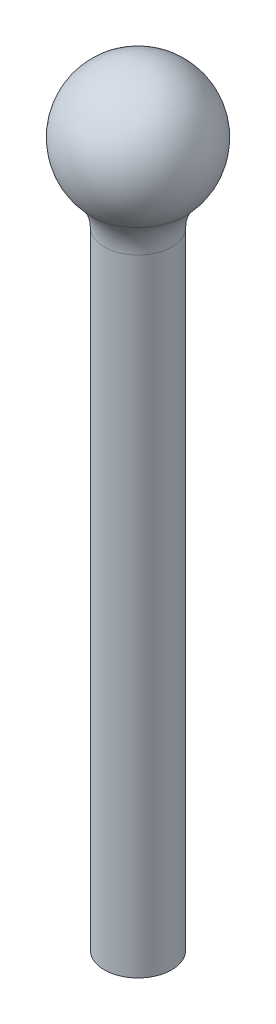
ISO-10303-21;
HEADER;
FILE_DESCRIPTION(('STEP AP214'),'2;1');
FILE_NAME('part.step','',(''),(''),'','','');
FILE_SCHEMA(('AUTOMOTIVE_DESIGN { 1 0 10303 214 1 1 1 1 }'));
ENDSEC;
DATA;
#1=APPLICATION_CONTEXT('core data for automotive mechanical design processes');
#2=APPLICATION_PROTOCOL_DEFINITION('international standard','automotive_design',2000,#1);
#3=PRODUCT_CONTEXT('',#1,'mechanical');
#4=PRODUCT('Part','Part','',(#3));
#5=PRODUCT_RELATED_PRODUCT_CATEGORY('part','',(#4));
#6=PRODUCT_DEFINITION_FORMATION('','',#4);
#7=PRODUCT_DEFINITION_CONTEXT('part definition',#1,'design');
#8=PRODUCT_DEFINITION('design','',#6,#7);
#9=PRODUCT_DEFINITION_SHAPE('','',#8);
#10=(LENGTH_UNIT() NAMED_UNIT(*) SI_UNIT(.MILLI.,.METRE.));
#11=(NAMED_UNIT(*) PLANE_ANGLE_UNIT() SI_UNIT($,.RADIAN.));
#12=(NAMED_UNIT(*) SI_UNIT($,.STERADIAN.) SOLID_ANGLE_UNIT());
#13=UNCERTAINTY_MEASURE_WITH_UNIT(LENGTH_MEASURE(1.E-05),#10,'distance_accuracy_value','');
#14=(GEOMETRIC_REPRESENTATION_CONTEXT(3) GLOBAL_UNCERTAINTY_ASSIGNED_CONTEXT((#13)) GLOBAL_UNIT_ASSIGNED_CONTEXT((#10,
#11,#12)) REPRESENTATION_CONTEXT('',''));
#15=CARTESIAN_POINT('',(0.,0.,0.));
#16=DIRECTION('',(0.,0.,1.));
#17=DIRECTION('',(1.,0.,0.));
#18=AXIS2_PLACEMENT_3D('',#15,#16,#17);
#19=CARTESIAN_POINT('',(0.,-8.11249036979397,0.));
#20=DIRECTION('',(0.,1.,0.));
#21=DIRECTION('',(-1.,0.,0.));
#22=AXIS2_PLACEMENT_3D('',#19,#20,#21);
#23=TOROIDAL_SURFACE('',#22,8.50000000000001,5.);
#24=CARTESIAN_POINT('',(0.,-4.66036680817951,0.));
#25=DIRECTION('',(0.,1.,0.));
#26=DIRECTION('',(-1.,0.,0.));
#27=AXIS2_PLACEMENT_3D('',#24,#25,#26);
#28=CIRCLE('',#27,4.88297872340426);
#29=CARTESIAN_POINT('',(-4.88297872340426,-4.66036680817951,0.));
#30=VERTEX_POINT('',#29);
#31=EDGE_CURVE('E63',#30,#30,#28,.T.);
#32=ORIENTED_EDGE('',*,*,#31,.F.);
#33=EDGE_LOOP('',(#32));
#34=FACE_BOUND('',#33,.T.);
#35=CARTESIAN_POINT('',(0.,-8.11249036979397,0.));
#36=DIRECTION('',(0.,1.,0.));
#37=DIRECTION('',(-1.,0.,0.));
#38=AXIS2_PLACEMENT_3D('',#35,#36,#37);
#39=CIRCLE('',#38,3.50000000000001);
#40=CARTESIAN_POINT('',(-3.50000000000001,-8.11249036979397,0.));
#41=VERTEX_POINT('',#40);
#42=EDGE_CURVE('E10',#41,#41,#39,.T.);
#43=ORIENTED_EDGE('',*,*,#42,.T.);
#44=EDGE_LOOP('',(#43));
#45=FACE_BOUND('',#44,.T.);
#46=ADVANCED_FACE('F40',(#34,#45),#23,.F.);
#47=CARTESIAN_POINT('',(0.,6.75,0.));
#48=DIRECTION('',(0.,1.,0.));
#49=DIRECTION('',(-1.,0.,0.));
#50=AXIS2_PLACEMENT_3D('',#47,#48,#49);
#51=CYLINDRICAL_SURFACE('',#50,3.5);
#52=ORIENTED_EDGE('',*,*,#42,.F.);
#53=EDGE_LOOP('',(#52));
#54=FACE_BOUND('',#53,.T.);
#55=CARTESIAN_POINT('',(0.,-73.25,0.));
#56=DIRECTION('',(0.,1.,0.));
#57=DIRECTION('',(-1.,0.,0.));
#58=AXIS2_PLACEMENT_3D('',#55,#56,#57);
#59=CIRCLE('',#58,3.5);
#60=CARTESIAN_POINT('',(-3.49999999999999,-73.25,0.));
#61=VERTEX_POINT('',#60);
#62=EDGE_CURVE('E47',#61,#61,#59,.T.);
#63=ORIENTED_EDGE('',*,*,#62,.T.);
#64=EDGE_LOOP('',(#63));
#65=FACE_BOUND('',#64,.T.);
#66=ADVANCED_FACE('F71',(#54,#65),#51,.T.);
#67=CARTESIAN_POINT('',(1.25,-73.25,0.));
#68=DIRECTION('',(0.,1.,0.));
#69=DIRECTION('',(-1.,0.,0.));
#70=AXIS2_PLACEMENT_3D('',#67,#68,#69);
#71=PLANE('',#70);
#72=ORIENTED_EDGE('',*,*,#62,.F.);
#73=EDGE_LOOP('',(#72));
#74=FACE_BOUND('',#73,.T.);
#75=CARTESIAN_POINT('',(0.,-73.25,0.));
#76=DIRECTION('',(0.,1.,0.));
#77=DIRECTION('',(-1.,0.,0.));
#78=AXIS2_PLACEMENT_3D('',#75,#76,#77);
#79=CIRCLE('',#78,1.24999999999999);
#80=CARTESIAN_POINT('',(-1.24999999999998,-73.25,0.));
#81=VERTEX_POINT('',#80);
#82=EDGE_CURVE('E52',#81,#81,#79,.T.);
#83=ORIENTED_EDGE('',*,*,#82,.T.);
#84=EDGE_LOOP('',(#83));
#85=FACE_BOUND('',#84,.T.);
#86=ADVANCED_FACE('F75',(#74,#85),#71,.F.);
#87=CARTESIAN_POINT('',(0.,6.75,0.));
#88=DIRECTION('',(0.,1.,0.));
#89=DIRECTION('',(-1.,0.,0.));
#90=AXIS2_PLACEMENT_3D('',#87,#88,#89);
#91=CYLINDRICAL_SURFACE('',#90,1.25);
#92=ORIENTED_EDGE('',*,*,#82,.F.);
#93=EDGE_LOOP('',(#92));
#94=FACE_BOUND('',#93,.T.);
#95=CARTESIAN_POINT('',(0.,-18.25,0.));
#96=DIRECTION('',(0.,1.,0.));
#97=DIRECTION('',(-1.,0.,0.));
#98=AXIS2_PLACEMENT_3D('',#95,#96,#97);
#99=CIRCLE('',#98,1.25);
#100=CARTESIAN_POINT('',(-1.25,-18.25,0.));
#101=VERTEX_POINT('',#100);
#102=EDGE_CURVE('E57',#101,#101,#99,.T.);
#103=ORIENTED_EDGE('',*,*,#102,.T.);
#104=EDGE_LOOP('',(#103));
#105=FACE_BOUND('',#104,.T.);
#106=ADVANCED_FACE('F80',(#94,#105),#91,.F.);
#107=CARTESIAN_POINT('',(1.25,-18.25,0.));
#108=DIRECTION('',(0.,1.,0.));
#109=DIRECTION('',(-1.,0.,0.));
#110=AXIS2_PLACEMENT_3D('',#107,#108,#109);
#111=PLANE('',#110);
#112=ORIENTED_EDGE('',*,*,#102,.F.);
#113=EDGE_LOOP('',(#112));
#114=FACE_BOUND('',#113,.T.);
#115=ADVANCED_FACE('F86',(#114),#111,.F.);
#116=CARTESIAN_POINT('',(0.,0.,0.));
#117=DIRECTION('',(0.,1.,0.));
#118=DIRECTION('',(1.,0.,0.));
#119=AXIS2_PLACEMENT_3D('',#116,#117,#118);
#120=SPHERICAL_SURFACE('',#119,6.75);
#121=ORIENTED_EDGE('',*,*,#31,.T.);
#122=EDGE_LOOP('',(#121));
#123=FACE_BOUND('',#122,.T.);
#124=ADVANCED_FACE('F68',(#123),#120,.T.);
#125=CLOSED_SHELL('',(#46,#66,#86,#106,#115,#124));
#126=MANIFOLD_SOLID_BREP('B2',#125);
#127=ADVANCED_BREP_SHAPE_REPRESENTATION('',(#18,#126),#14);
#128=SHAPE_DEFINITION_REPRESENTATION(#9,#127);
ENDSEC;
END-ISO-10303-21;
